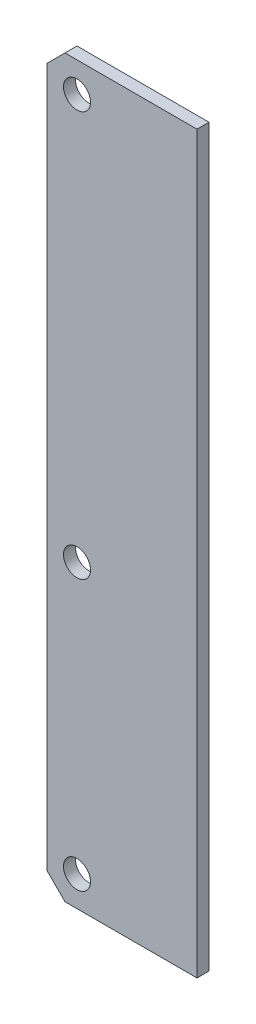
ISO-10303-21;
HEADER;
FILE_DESCRIPTION(('STEP AP214'),'2;1');
FILE_NAME('part.step','',(''),(''),'','','');
FILE_SCHEMA(('AUTOMOTIVE_DESIGN { 1 0 10303 214 1 1 1 1 }'));
ENDSEC;
DATA;
#1=APPLICATION_CONTEXT('core data for automotive mechanical design processes');
#2=APPLICATION_PROTOCOL_DEFINITION('international standard','automotive_design',2000,#1);
#3=PRODUCT_CONTEXT('',#1,'mechanical');
#4=PRODUCT('Part','Part','',(#3));
#5=PRODUCT_RELATED_PRODUCT_CATEGORY('part','',(#4));
#6=PRODUCT_DEFINITION_FORMATION('','',#4);
#7=PRODUCT_DEFINITION_CONTEXT('part definition',#1,'design');
#8=PRODUCT_DEFINITION('design','',#6,#7);
#9=PRODUCT_DEFINITION_SHAPE('','',#8);
#10=(LENGTH_UNIT() NAMED_UNIT(*) SI_UNIT(.MILLI.,.METRE.));
#11=(NAMED_UNIT(*) PLANE_ANGLE_UNIT() SI_UNIT($,.RADIAN.));
#12=(NAMED_UNIT(*) SI_UNIT($,.STERADIAN.) SOLID_ANGLE_UNIT());
#13=UNCERTAINTY_MEASURE_WITH_UNIT(LENGTH_MEASURE(1.E-05),#10,'distance_accuracy_value','');
#14=(GEOMETRIC_REPRESENTATION_CONTEXT(3) GLOBAL_UNCERTAINTY_ASSIGNED_CONTEXT((#13)) GLOBAL_UNIT_ASSIGNED_CONTEXT((#10,
#11,#12)) REPRESENTATION_CONTEXT('',''));
#15=CARTESIAN_POINT('',(0.,0.,0.));
#16=DIRECTION('',(0.,0.,1.));
#17=DIRECTION('',(1.,0.,0.));
#18=AXIS2_PLACEMENT_3D('',#15,#16,#17);
#19=CARTESIAN_POINT('',(0.,0.,0.));
#20=DIRECTION('',(0.,0.,-1.));
#21=DIRECTION('',(-1.,0.,0.));
#22=AXIS2_PLACEMENT_3D('',#19,#20,#21);
#23=PLANE('',#22);
#24=CARTESIAN_POINT('',(-40.,-22.5,0.));
#25=DIRECTION('',(0.,0.,-1.));
#26=DIRECTION('',(-1.,0.,0.));
#27=AXIS2_PLACEMENT_3D('',#24,#25,#26);
#28=CIRCLE('',#27,4.5);
#29=CARTESIAN_POINT('',(-44.5,-22.5,0.));
#30=VERTEX_POINT('',#29);
#31=EDGE_CURVE('E98',#30,#30,#28,.F.);
#32=ORIENTED_EDGE('',*,*,#31,.T.);
#33=EDGE_LOOP('',(#32));
#34=FACE_BOUND('',#33,.T.);
#35=CARTESIAN_POINT('',(-40.,112.5,0.));
#36=DIRECTION('',(0.,0.,-1.));
#37=DIRECTION('',(-1.,0.,0.));
#38=AXIS2_PLACEMENT_3D('',#35,#36,#37);
#39=CIRCLE('',#38,4.5);
#40=CARTESIAN_POINT('',(-44.5,112.5,0.));
#41=VERTEX_POINT('',#40);
#42=EDGE_CURVE('E19',#41,#41,#39,.F.);
#43=ORIENTED_EDGE('',*,*,#42,.T.);
#44=EDGE_LOOP('',(#43));
#45=FACE_BOUND('',#44,.T.);
#46=DIRECTION('',(1.,0.,0.));
#47=VECTOR('',#46,1.);
#48=CARTESIAN_POINT('',(-50.,122.5,0.));
#49=LINE('',#48,#47);
#50=CARTESIAN_POINT('',(-43.9999999999999,122.5,0.));
#51=VERTEX_POINT('',#50);
#52=CARTESIAN_POINT('',(0.,122.5,0.));
#53=VERTEX_POINT('',#52);
#54=EDGE_CURVE('E67',#51,#53,#49,.T.);
#55=ORIENTED_EDGE('',*,*,#54,.T.);
#56=DIRECTION('',(0.,-1.,0.));
#57=VECTOR('',#56,1.);
#58=CARTESIAN_POINT('',(0.,122.5,0.));
#59=LINE('',#58,#57);
#60=CARTESIAN_POINT('',(0.,-122.5,0.));
#61=VERTEX_POINT('',#60);
#62=EDGE_CURVE('E123',#53,#61,#59,.T.);
#63=ORIENTED_EDGE('',*,*,#62,.T.);
#64=DIRECTION('',(1.,0.,0.));
#65=VECTOR('',#64,1.);
#66=CARTESIAN_POINT('',(0.,-122.5,0.));
#67=LINE('',#66,#65);
#68=CARTESIAN_POINT('',(-44.,-122.5,0.));
#69=VERTEX_POINT('',#68);
#70=EDGE_CURVE('E118',#61,#69,#67,.F.);
#71=ORIENTED_EDGE('',*,*,#70,.T.);
#72=DIRECTION('',(-0.707106781186548,0.707106781186548,0.));
#73=VECTOR('',#72,1.);
#74=CARTESIAN_POINT('',(-44.,-122.5,0.));
#75=LINE('',#74,#73);
#76=CARTESIAN_POINT('',(-50.,-116.5,0.));
#77=VERTEX_POINT('',#76);
#78=EDGE_CURVE('E113',#69,#77,#75,.T.);
#79=ORIENTED_EDGE('',*,*,#78,.T.);
#80=DIRECTION('',(0.,1.,0.));
#81=VECTOR('',#80,1.);
#82=CARTESIAN_POINT('',(-50.,-122.5,0.));
#83=LINE('',#82,#81);
#84=CARTESIAN_POINT('',(-50.,116.5,0.));
#85=VERTEX_POINT('',#84);
#86=EDGE_CURVE('E72',#77,#85,#83,.T.);
#87=ORIENTED_EDGE('',*,*,#86,.T.);
#88=DIRECTION('',(0.707106781186551,0.707106781186544,0.));
#89=VECTOR('',#88,1.);
#90=CARTESIAN_POINT('',(-50.,116.5,0.));
#91=LINE('',#90,#89);
#92=EDGE_CURVE('E70',#85,#51,#91,.T.);
#93=ORIENTED_EDGE('',*,*,#92,.T.);
#94=EDGE_LOOP('',(#55,#63,#71,#79,#87,#93));
#95=FACE_BOUND('',#94,.T.);
#96=CARTESIAN_POINT('',(-40.,-112.5,0.));
#97=DIRECTION('',(0.,0.,-1.));
#98=DIRECTION('',(-1.,0.,0.));
#99=AXIS2_PLACEMENT_3D('',#96,#97,#98);
#100=CIRCLE('',#99,4.5);
#101=CARTESIAN_POINT('',(-44.5,-112.5,0.));
#102=VERTEX_POINT('',#101);
#103=EDGE_CURVE('E100',#102,#102,#100,.F.);
#104=ORIENTED_EDGE('',*,*,#103,.T.);
#105=EDGE_LOOP('',(#104));
#106=FACE_BOUND('',#105,.T.);
#107=ADVANCED_FACE('F16',(#34,#45,#95,#106),#23,.T.);
#108=CARTESIAN_POINT('',(-50.,116.5,4.));
#109=DIRECTION('',(0.707106781186544,-0.707106781186551,0.));
#110=DIRECTION('',(0.707106781186551,0.707106781186544,0.));
#111=AXIS2_PLACEMENT_3D('',#108,#109,#110);
#112=PLANE('',#111);
#113=DIRECTION('',(0.,0.,-1.));
#114=VECTOR('',#113,1.);
#115=CARTESIAN_POINT('',(-43.9999999999999,122.5,4.));
#116=LINE('',#115,#114);
#117=CARTESIAN_POINT('',(-43.9999999999999,122.5,4.));
#118=VERTEX_POINT('',#117);
#119=EDGE_CURVE('E77',#118,#51,#116,.T.);
#120=ORIENTED_EDGE('',*,*,#119,.T.);
#121=ORIENTED_EDGE('',*,*,#92,.F.);
#122=DIRECTION('',(0.,0.,-1.));
#123=VECTOR('',#122,1.);
#124=CARTESIAN_POINT('',(-50.,116.5,4.));
#125=LINE('',#124,#123);
#126=CARTESIAN_POINT('',(-50.,116.5,4.));
#127=VERTEX_POINT('',#126);
#128=EDGE_CURVE('E107',#85,#127,#125,.F.);
#129=ORIENTED_EDGE('',*,*,#128,.T.);
#130=DIRECTION('',(0.707106781186552,0.707106781186543,0.));
#131=VECTOR('',#130,1.);
#132=CARTESIAN_POINT('',(-50.,116.5,4.));
#133=LINE('',#132,#131);
#134=EDGE_CURVE('E88',#127,#118,#133,.T.);
#135=ORIENTED_EDGE('',*,*,#134,.T.);
#136=EDGE_LOOP('',(#120,#121,#129,#135));
#137=FACE_BOUND('',#136,.T.);
#138=ADVANCED_FACE('F87',(#137),#112,.F.);
#139=CARTESIAN_POINT('',(-50.,122.5,4.));
#140=DIRECTION('',(0.,-1.,0.));
#141=DIRECTION('',(0.,0.,-1.));
#142=AXIS2_PLACEMENT_3D('',#139,#140,#141);
#143=PLANE('',#142);
#144=ORIENTED_EDGE('',*,*,#119,.F.);
#145=DIRECTION('',(-1.,0.,0.));
#146=VECTOR('',#145,1.);
#147=CARTESIAN_POINT('',(0.,122.5,4.));
#148=LINE('',#147,#146);
#149=CARTESIAN_POINT('',(0.,122.5,4.));
#150=VERTEX_POINT('',#149);
#151=EDGE_CURVE('E137',#118,#150,#148,.F.);
#152=ORIENTED_EDGE('',*,*,#151,.T.);
#153=DIRECTION('',(0.,0.,1.));
#154=VECTOR('',#153,1.);
#155=CARTESIAN_POINT('',(0.,122.5,4.));
#156=LINE('',#155,#154);
#157=EDGE_CURVE('E84',#150,#53,#156,.F.);
#158=ORIENTED_EDGE('',*,*,#157,.T.);
#159=ORIENTED_EDGE('',*,*,#54,.F.);
#160=EDGE_LOOP('',(#144,#152,#158,#159));
#161=FACE_BOUND('',#160,.T.);
#162=ADVANCED_FACE('F81',(#161),#143,.F.);
#163=CARTESIAN_POINT('',(0.,122.5,4.));
#164=DIRECTION('',(-1.,0.,0.));
#165=DIRECTION('',(0.,-1.,0.));
#166=AXIS2_PLACEMENT_3D('',#163,#164,#165);
#167=PLANE('',#166);
#168=ORIENTED_EDGE('',*,*,#157,.F.);
#169=DIRECTION('',(0.,1.,0.));
#170=VECTOR('',#169,1.);
#171=CARTESIAN_POINT('',(0.,0.,4.));
#172=LINE('',#171,#170);
#173=CARTESIAN_POINT('',(0.,-122.5,4.));
#174=VERTEX_POINT('',#173);
#175=EDGE_CURVE('E134',#150,#174,#172,.F.);
#176=ORIENTED_EDGE('',*,*,#175,.T.);
#177=DIRECTION('',(0.,0.,1.));
#178=VECTOR('',#177,1.);
#179=CARTESIAN_POINT('',(0.,-122.5,4.));
#180=LINE('',#179,#178);
#181=EDGE_CURVE('E120',#174,#61,#180,.F.);
#182=ORIENTED_EDGE('',*,*,#181,.T.);
#183=ORIENTED_EDGE('',*,*,#62,.F.);
#184=EDGE_LOOP('',(#168,#176,#182,#183));
#185=FACE_BOUND('',#184,.T.);
#186=ADVANCED_FACE('F132',(#185),#167,.F.);
#187=CARTESIAN_POINT('',(0.,-122.5,4.));
#188=DIRECTION('',(0.,1.,0.));
#189=DIRECTION('',(0.,0.,1.));
#190=AXIS2_PLACEMENT_3D('',#187,#188,#189);
#191=PLANE('',#190);
#192=DIRECTION('',(0.,0.,1.));
#193=VECTOR('',#192,1.);
#194=CARTESIAN_POINT('',(-44.,-122.5,4.));
#195=LINE('',#194,#193);
#196=CARTESIAN_POINT('',(-44.,-122.5,4.));
#197=VERTEX_POINT('',#196);
#198=EDGE_CURVE('E115',#197,#69,#195,.F.);
#199=ORIENTED_EDGE('',*,*,#198,.T.);
#200=ORIENTED_EDGE('',*,*,#70,.F.);
#201=ORIENTED_EDGE('',*,*,#181,.F.);
#202=DIRECTION('',(-1.,0.,0.));
#203=VECTOR('',#202,1.);
#204=CARTESIAN_POINT('',(0.,-122.5,4.));
#205=LINE('',#204,#203);
#206=EDGE_CURVE('E136',#174,#197,#205,.T.);
#207=ORIENTED_EDGE('',*,*,#206,.T.);
#208=EDGE_LOOP('',(#199,#200,#201,#207));
#209=FACE_BOUND('',#208,.T.);
#210=ADVANCED_FACE('F128',(#209),#191,.F.);
#211=CARTESIAN_POINT('',(-44.,-122.5,4.));
#212=DIRECTION('',(0.707106781186548,0.707106781186548,0.));
#213=DIRECTION('',(-0.707106781186548,0.707106781186548,0.));
#214=AXIS2_PLACEMENT_3D('',#211,#212,#213);
#215=PLANE('',#214);
#216=DIRECTION('',(0.,0.,-1.));
#217=VECTOR('',#216,1.);
#218=CARTESIAN_POINT('',(-50.,-116.5,4.));
#219=LINE('',#218,#217);
#220=CARTESIAN_POINT('',(-50.,-116.5,4.));
#221=VERTEX_POINT('',#220);
#222=EDGE_CURVE('E34',#221,#77,#219,.T.);
#223=ORIENTED_EDGE('',*,*,#222,.T.);
#224=ORIENTED_EDGE('',*,*,#78,.F.);
#225=ORIENTED_EDGE('',*,*,#198,.F.);
#226=DIRECTION('',(-0.707106781186548,0.707106781186547,0.));
#227=VECTOR('',#226,1.);
#228=CARTESIAN_POINT('',(-44.,-122.5,4.));
#229=LINE('',#228,#227);
#230=EDGE_CURVE('E139',#197,#221,#229,.T.);
#231=ORIENTED_EDGE('',*,*,#230,.T.);
#232=EDGE_LOOP('',(#223,#224,#225,#231));
#233=FACE_BOUND('',#232,.T.);
#234=ADVANCED_FACE('F148',(#233),#215,.F.);
#235=CARTESIAN_POINT('',(-50.,-122.5,4.));
#236=DIRECTION('',(1.,0.,0.));
#237=DIRECTION('',(0.,0.,-1.));
#238=AXIS2_PLACEMENT_3D('',#235,#236,#237);
#239=PLANE('',#238);
#240=ORIENTED_EDGE('',*,*,#222,.F.);
#241=DIRECTION('',(0.,1.,0.));
#242=VECTOR('',#241,1.);
#243=CARTESIAN_POINT('',(-50.,0.,4.));
#244=LINE('',#243,#242);
#245=EDGE_CURVE('E97',#221,#127,#244,.T.);
#246=ORIENTED_EDGE('',*,*,#245,.T.);
#247=ORIENTED_EDGE('',*,*,#128,.F.);
#248=ORIENTED_EDGE('',*,*,#86,.F.);
#249=EDGE_LOOP('',(#240,#246,#247,#248));
#250=FACE_BOUND('',#249,.T.);
#251=ADVANCED_FACE('F144',(#250),#239,.F.);
#252=CARTESIAN_POINT('',(-40.,112.5,4.));
#253=DIRECTION('',(0.,0.,-1.));
#254=DIRECTION('',(-1.,0.,0.));
#255=AXIS2_PLACEMENT_3D('',#252,#253,#254);
#256=CYLINDRICAL_SURFACE('',#255,4.5);
#257=ORIENTED_EDGE('',*,*,#42,.F.);
#258=EDGE_LOOP('',(#257));
#259=FACE_BOUND('',#258,.T.);
#260=CARTESIAN_POINT('',(-40.,112.5,4.));
#261=DIRECTION('',(0.,0.,-1.));
#262=DIRECTION('',(-1.,0.,0.));
#263=AXIS2_PLACEMENT_3D('',#260,#261,#262);
#264=CIRCLE('',#263,4.5);
#265=CARTESIAN_POINT('',(-44.5,112.5,4.));
#266=VERTEX_POINT('',#265);
#267=EDGE_CURVE('E94',#266,#266,#264,.F.);
#268=ORIENTED_EDGE('',*,*,#267,.T.);
#269=EDGE_LOOP('',(#268));
#270=FACE_BOUND('',#269,.T.);
#271=ADVANCED_FACE('F157',(#259,#270),#256,.F.);
#272=CARTESIAN_POINT('',(-40.,-112.5,4.));
#273=DIRECTION('',(0.,0.,-1.));
#274=DIRECTION('',(-1.,0.,0.));
#275=AXIS2_PLACEMENT_3D('',#272,#273,#274);
#276=CYLINDRICAL_SURFACE('',#275,4.5);
#277=ORIENTED_EDGE('',*,*,#103,.F.);
#278=EDGE_LOOP('',(#277));
#279=FACE_BOUND('',#278,.T.);
#280=CARTESIAN_POINT('',(-40.,-112.5,4.));
#281=DIRECTION('',(0.,0.,-1.));
#282=DIRECTION('',(-1.,0.,0.));
#283=AXIS2_PLACEMENT_3D('',#280,#281,#282);
#284=CIRCLE('',#283,4.5);
#285=CARTESIAN_POINT('',(-44.5,-112.5,4.));
#286=VERTEX_POINT('',#285);
#287=EDGE_CURVE('E25',#286,#286,#284,.F.);
#288=ORIENTED_EDGE('',*,*,#287,.T.);
#289=EDGE_LOOP('',(#288));
#290=FACE_BOUND('',#289,.T.);
#291=ADVANCED_FACE('F170',(#279,#290),#276,.F.);
#292=CARTESIAN_POINT('',(-40.,-22.5,4.));
#293=DIRECTION('',(0.,0.,-1.));
#294=DIRECTION('',(-1.,0.,0.));
#295=AXIS2_PLACEMENT_3D('',#292,#293,#294);
#296=CYLINDRICAL_SURFACE('',#295,4.5);
#297=ORIENTED_EDGE('',*,*,#31,.F.);
#298=EDGE_LOOP('',(#297));
#299=FACE_BOUND('',#298,.T.);
#300=CARTESIAN_POINT('',(-40.,-22.5,4.));
#301=DIRECTION('',(0.,0.,-1.));
#302=DIRECTION('',(-1.,0.,0.));
#303=AXIS2_PLACEMENT_3D('',#300,#301,#302);
#304=CIRCLE('',#303,4.5);
#305=CARTESIAN_POINT('',(-44.5,-22.5,4.));
#306=VERTEX_POINT('',#305);
#307=EDGE_CURVE('E11',#306,#306,#304,.F.);
#308=ORIENTED_EDGE('',*,*,#307,.T.);
#309=EDGE_LOOP('',(#308));
#310=FACE_BOUND('',#309,.T.);
#311=ADVANCED_FACE('F161',(#299,#310),#296,.F.);
#312=CARTESIAN_POINT('',(0.,0.,4.));
#313=DIRECTION('',(0.,0.,-1.));
#314=DIRECTION('',(-1.,0.,0.));
#315=AXIS2_PLACEMENT_3D('',#312,#313,#314);
#316=PLANE('',#315);
#317=ORIENTED_EDGE('',*,*,#307,.F.);
#318=EDGE_LOOP('',(#317));
#319=FACE_BOUND('',#318,.T.);
#320=ORIENTED_EDGE('',*,*,#287,.F.);
#321=EDGE_LOOP('',(#320));
#322=FACE_BOUND('',#321,.T.);
#323=ORIENTED_EDGE('',*,*,#267,.F.);
#324=EDGE_LOOP('',(#323));
#325=FACE_BOUND('',#324,.T.);
#326=ORIENTED_EDGE('',*,*,#230,.F.);
#327=ORIENTED_EDGE('',*,*,#206,.F.);
#328=ORIENTED_EDGE('',*,*,#175,.F.);
#329=ORIENTED_EDGE('',*,*,#151,.F.);
#330=ORIENTED_EDGE('',*,*,#134,.F.);
#331=ORIENTED_EDGE('',*,*,#245,.F.);
#332=EDGE_LOOP('',(#326,#327,#328,#329,#330,#331));
#333=FACE_BOUND('',#332,.T.);
#334=ADVANCED_FACE('F146',(#319,#322,#325,#333),#316,.F.);
#335=CLOSED_SHELL('',(#107,#138,#162,#186,#210,#234,#251,#271,#291,#311,#334));
#336=MANIFOLD_SOLID_BREP('B1',#335);
#337=ADVANCED_BREP_SHAPE_REPRESENTATION('',(#18,#336),#14);
#338=SHAPE_DEFINITION_REPRESENTATION(#9,#337);
ENDSEC;
END-ISO-10303-21;
